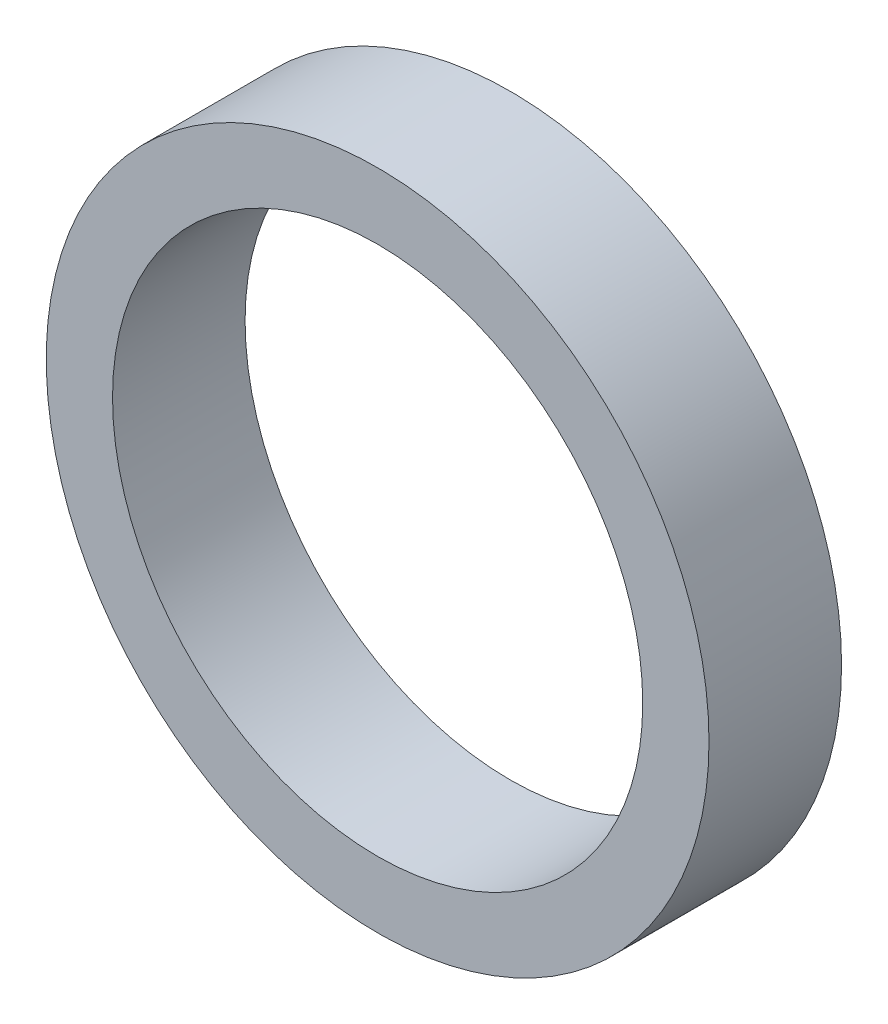
ISO-10303-21;
HEADER;
FILE_DESCRIPTION(('STEP AP214'),'2;1');
FILE_NAME('part.step','',(''),(''),'','','');
FILE_SCHEMA(('AUTOMOTIVE_DESIGN { 1 0 10303 214 1 1 1 1 }'));
ENDSEC;
DATA;
#1=APPLICATION_CONTEXT('core data for automotive mechanical design processes');
#2=APPLICATION_PROTOCOL_DEFINITION('international standard','automotive_design',2000,#1);
#3=PRODUCT_CONTEXT('',#1,'mechanical');
#4=PRODUCT('Part','Part','',(#3));
#5=PRODUCT_RELATED_PRODUCT_CATEGORY('part','',(#4));
#6=PRODUCT_DEFINITION_FORMATION('','',#4);
#7=PRODUCT_DEFINITION_CONTEXT('part definition',#1,'design');
#8=PRODUCT_DEFINITION('design','',#6,#7);
#9=PRODUCT_DEFINITION_SHAPE('','',#8);
#10=(LENGTH_UNIT() NAMED_UNIT(*) SI_UNIT(.MILLI.,.METRE.));
#11=(NAMED_UNIT(*) PLANE_ANGLE_UNIT() SI_UNIT($,.RADIAN.));
#12=(NAMED_UNIT(*) SI_UNIT($,.STERADIAN.) SOLID_ANGLE_UNIT());
#13=UNCERTAINTY_MEASURE_WITH_UNIT(LENGTH_MEASURE(1.E-05),#10,'distance_accuracy_value','');
#14=(GEOMETRIC_REPRESENTATION_CONTEXT(3) GLOBAL_UNCERTAINTY_ASSIGNED_CONTEXT((#13)) GLOBAL_UNIT_ASSIGNED_CONTEXT((#10,
#11,#12)) REPRESENTATION_CONTEXT('',''));
#15=CARTESIAN_POINT('',(0.,0.,0.));
#16=DIRECTION('',(0.,0.,1.));
#17=DIRECTION('',(1.,0.,0.));
#18=AXIS2_PLACEMENT_3D('',#15,#16,#17);
#19=CARTESIAN_POINT('',(0.,0.,200.));
#20=DIRECTION('',(0.,0.,1.));
#21=DIRECTION('',(1.,0.,0.));
#22=AXIS2_PLACEMENT_3D('',#19,#20,#21);
#23=PLANE('',#22);
#24=CARTESIAN_POINT('',(0.,0.,200.));
#25=DIRECTION('',(0.,0.,1.));
#26=DIRECTION('',(1.,0.,0.));
#27=AXIS2_PLACEMENT_3D('',#24,#25,#26);
#28=CIRCLE('',#27,500.);
#29=CARTESIAN_POINT('',(500.,0.,200.));
#30=VERTEX_POINT('',#29);
#31=EDGE_CURVE('E10',#30,#30,#28,.T.);
#32=ORIENTED_EDGE('',*,*,#31,.T.);
#33=EDGE_LOOP('',(#32));
#34=FACE_BOUND('',#33,.T.);
#35=CARTESIAN_POINT('',(0.,0.,200.));
#36=DIRECTION('',(0.,0.,1.));
#37=DIRECTION('',(1.,0.,0.));
#38=AXIS2_PLACEMENT_3D('',#35,#36,#37);
#39=CIRCLE('',#38,400.);
#40=CARTESIAN_POINT('',(400.,0.,200.));
#41=VERTEX_POINT('',#40);
#42=EDGE_CURVE('E42',#41,#41,#39,.T.);
#43=ORIENTED_EDGE('',*,*,#42,.F.);
#44=EDGE_LOOP('',(#43));
#45=FACE_BOUND('',#44,.T.);
#46=ADVANCED_FACE('F31',(#34,#45),#23,.T.);
#47=CARTESIAN_POINT('',(0.,0.,0.));
#48=DIRECTION('',(0.,0.,1.));
#49=DIRECTION('',(1.,0.,0.));
#50=AXIS2_PLACEMENT_3D('',#47,#48,#49);
#51=PLANE('',#50);
#52=CARTESIAN_POINT('',(0.,0.,0.));
#53=DIRECTION('',(0.,0.,1.));
#54=DIRECTION('',(1.,0.,0.));
#55=AXIS2_PLACEMENT_3D('',#52,#53,#54);
#56=CIRCLE('',#55,500.);
#57=CARTESIAN_POINT('',(500.,0.,0.));
#58=VERTEX_POINT('',#57);
#59=EDGE_CURVE('E35',#58,#58,#56,.T.);
#60=ORIENTED_EDGE('',*,*,#59,.F.);
#61=EDGE_LOOP('',(#60));
#62=FACE_BOUND('',#61,.T.);
#63=CARTESIAN_POINT('',(0.,0.,0.));
#64=DIRECTION('',(0.,0.,1.));
#65=DIRECTION('',(1.,0.,0.));
#66=AXIS2_PLACEMENT_3D('',#63,#64,#65);
#67=CIRCLE('',#66,400.);
#68=CARTESIAN_POINT('',(400.,0.,0.));
#69=VERTEX_POINT('',#68);
#70=EDGE_CURVE('E44',#69,#69,#67,.T.);
#71=ORIENTED_EDGE('',*,*,#70,.T.);
#72=EDGE_LOOP('',(#71));
#73=FACE_BOUND('',#72,.T.);
#74=ADVANCED_FACE('F54',(#62,#73),#51,.F.);
#75=CARTESIAN_POINT('',(0.,0.,200.));
#76=DIRECTION('',(0.,0.,-1.));
#77=DIRECTION('',(-1.,0.,0.));
#78=AXIS2_PLACEMENT_3D('',#75,#76,#77);
#79=CYLINDRICAL_SURFACE('',#78,500.);
#80=ORIENTED_EDGE('',*,*,#31,.F.);
#81=EDGE_LOOP('',(#80));
#82=FACE_BOUND('',#81,.T.);
#83=ORIENTED_EDGE('',*,*,#59,.T.);
#84=EDGE_LOOP('',(#83));
#85=FACE_BOUND('',#84,.T.);
#86=ADVANCED_FACE('F33',(#82,#85),#79,.T.);
#87=CARTESIAN_POINT('',(0.,0.,200.));
#88=DIRECTION('',(0.,0.,-1.));
#89=DIRECTION('',(-1.,0.,0.));
#90=AXIS2_PLACEMENT_3D('',#87,#88,#89);
#91=CYLINDRICAL_SURFACE('',#90,400.);
#92=ORIENTED_EDGE('',*,*,#42,.T.);
#93=EDGE_LOOP('',(#92));
#94=FACE_BOUND('',#93,.T.);
#95=ORIENTED_EDGE('',*,*,#70,.F.);
#96=EDGE_LOOP('',(#95));
#97=FACE_BOUND('',#96,.T.);
#98=ADVANCED_FACE('F50',(#94,#97),#91,.F.);
#99=CLOSED_SHELL('',(#46,#74,#86,#98));
#100=MANIFOLD_SOLID_BREP('B2',#99);
#101=ADVANCED_BREP_SHAPE_REPRESENTATION('',(#18,#100),#14);
#102=SHAPE_DEFINITION_REPRESENTATION(#9,#101);
ENDSEC;
END-ISO-10303-21;
